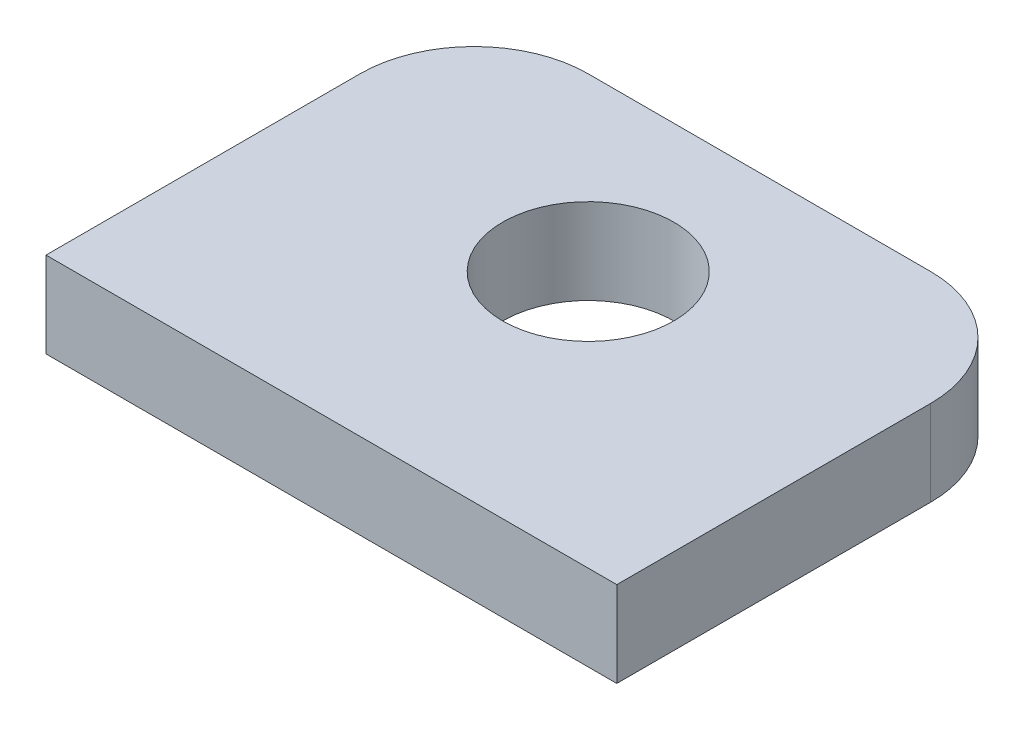
ISO-10303-21;
HEADER;
FILE_DESCRIPTION(('STEP AP214'),'2;1');
FILE_NAME('part.step','',(''),(''),'','','');
FILE_SCHEMA(('AUTOMOTIVE_DESIGN { 1 0 10303 214 1 1 1 1 }'));
ENDSEC;
DATA;
#1=APPLICATION_CONTEXT('core data for automotive mechanical design processes');
#2=APPLICATION_PROTOCOL_DEFINITION('international standard','automotive_design',2000,#1);
#3=PRODUCT_CONTEXT('',#1,'mechanical');
#4=PRODUCT('Part','Part','',(#3));
#5=PRODUCT_RELATED_PRODUCT_CATEGORY('part','',(#4));
#6=PRODUCT_DEFINITION_FORMATION('','',#4);
#7=PRODUCT_DEFINITION_CONTEXT('part definition',#1,'design');
#8=PRODUCT_DEFINITION('design','',#6,#7);
#9=PRODUCT_DEFINITION_SHAPE('','',#8);
#10=(LENGTH_UNIT() NAMED_UNIT(*) SI_UNIT(.MILLI.,.METRE.));
#11=(NAMED_UNIT(*) PLANE_ANGLE_UNIT() SI_UNIT($,.RADIAN.));
#12=(NAMED_UNIT(*) SI_UNIT($,.STERADIAN.) SOLID_ANGLE_UNIT());
#13=UNCERTAINTY_MEASURE_WITH_UNIT(LENGTH_MEASURE(1.E-05),#10,'distance_accuracy_value','');
#14=(GEOMETRIC_REPRESENTATION_CONTEXT(3) GLOBAL_UNCERTAINTY_ASSIGNED_CONTEXT((#13)) GLOBAL_UNIT_ASSIGNED_CONTEXT((#10,
#11,#12)) REPRESENTATION_CONTEXT('',''));
#15=CARTESIAN_POINT('',(0.,0.,0.));
#16=DIRECTION('',(0.,0.,1.));
#17=DIRECTION('',(1.,0.,0.));
#18=AXIS2_PLACEMENT_3D('',#15,#16,#17);
#19=CARTESIAN_POINT('',(3.,1.5,-1.75));
#20=DIRECTION('',(0.,-1.,0.));
#21=DIRECTION('',(0.,0.,-1.));
#22=AXIS2_PLACEMENT_3D('',#19,#20,#21);
#23=PLANE('',#22);
#24=CARTESIAN_POINT('',(3.,1.5,-1.75));
#25=DIRECTION('',(0.,1.,0.));
#26=DIRECTION('',(0.,0.,-1.));
#27=AXIS2_PLACEMENT_3D('',#24,#25,#26);
#28=CIRCLE('',#27,2.);
#29=CARTESIAN_POINT('',(5.,1.5,-1.74999999999999));
#30=VERTEX_POINT('',#29);
#31=CARTESIAN_POINT('',(2.99999999999999,1.5,-3.75));
#32=VERTEX_POINT('',#31);
#33=EDGE_CURVE('E131',#30,#32,#28,.T.);
#34=ORIENTED_EDGE('',*,*,#33,.T.);
#35=DIRECTION('',(-1.,0.,0.));
#36=VECTOR('',#35,1.);
#37=CARTESIAN_POINT('',(-2.99999999999999,1.5,-3.75));
#38=LINE('',#37,#36);
#39=CARTESIAN_POINT('',(-2.99999999999999,1.5,-3.75));
#40=VERTEX_POINT('',#39);
#41=EDGE_CURVE('E89',#32,#40,#38,.T.);
#42=ORIENTED_EDGE('',*,*,#41,.T.);
#43=CARTESIAN_POINT('',(-3.,1.5,-1.75));
#44=DIRECTION('',(0.,1.,0.));
#45=DIRECTION('',(0.,0.,-1.));
#46=AXIS2_PLACEMENT_3D('',#43,#44,#45);
#47=CIRCLE('',#46,2.);
#48=CARTESIAN_POINT('',(-5.,1.5,-1.74999999999999));
#49=VERTEX_POINT('',#48);
#50=EDGE_CURVE('E102',#40,#49,#47,.T.);
#51=ORIENTED_EDGE('',*,*,#50,.T.);
#52=DIRECTION('',(0.,0.,1.));
#53=VECTOR('',#52,1.);
#54=CARTESIAN_POINT('',(-5.,1.5,3.75));
#55=LINE('',#54,#53);
#56=CARTESIAN_POINT('',(-5.,1.5,3.75));
#57=VERTEX_POINT('',#56);
#58=EDGE_CURVE('E96',#49,#57,#55,.T.);
#59=ORIENTED_EDGE('',*,*,#58,.T.);
#60=DIRECTION('',(1.,0.,0.));
#61=VECTOR('',#60,1.);
#62=CARTESIAN_POINT('',(-5.,1.5,3.75));
#63=LINE('',#62,#61);
#64=CARTESIAN_POINT('',(5.,1.5,3.75));
#65=VERTEX_POINT('',#64);
#66=EDGE_CURVE('E100',#57,#65,#63,.T.);
#67=ORIENTED_EDGE('',*,*,#66,.T.);
#68=DIRECTION('',(0.,0.,-1.));
#69=VECTOR('',#68,1.);
#70=CARTESIAN_POINT('',(5.,1.5,3.75));
#71=LINE('',#70,#69);
#72=EDGE_CURVE('E52',#65,#30,#71,.T.);
#73=ORIENTED_EDGE('',*,*,#72,.T.);
#74=EDGE_LOOP('',(#34,#42,#51,#59,#67,#73));
#75=FACE_BOUND('',#74,.T.);
#76=CARTESIAN_POINT('',(0.,1.5,-0.75));
#77=DIRECTION('',(0.,1.,0.));
#78=DIRECTION('',(0.,0.,1.));
#79=AXIS2_PLACEMENT_3D('',#76,#77,#78);
#80=CIRCLE('',#79,1.5);
#81=CARTESIAN_POINT('',(0.,1.5,0.750000000000001));
#82=VERTEX_POINT('',#81);
#83=EDGE_CURVE('E124',#82,#82,#80,.T.);
#84=ORIENTED_EDGE('',*,*,#83,.F.);
#85=EDGE_LOOP('',(#84));
#86=FACE_BOUND('',#85,.T.);
#87=ADVANCED_FACE('F35',(#75,#86),#23,.F.);
#88=CARTESIAN_POINT('',(3.,0.,-1.75));
#89=DIRECTION('',(0.,-1.,0.));
#90=DIRECTION('',(0.,0.,-1.));
#91=AXIS2_PLACEMENT_3D('',#88,#89,#90);
#92=PLANE('',#91);
#93=CARTESIAN_POINT('',(3.,0.,-1.75));
#94=DIRECTION('',(0.,1.,0.));
#95=DIRECTION('',(0.,0.,-1.));
#96=AXIS2_PLACEMENT_3D('',#93,#94,#95);
#97=CIRCLE('',#96,2.);
#98=CARTESIAN_POINT('',(5.,0.,-1.74999999999999));
#99=VERTEX_POINT('',#98);
#100=CARTESIAN_POINT('',(2.99999999999999,0.,-3.75));
#101=VERTEX_POINT('',#100);
#102=EDGE_CURVE('E120',#99,#101,#97,.T.);
#103=ORIENTED_EDGE('',*,*,#102,.F.);
#104=DIRECTION('',(0.,0.,-1.));
#105=VECTOR('',#104,1.);
#106=CARTESIAN_POINT('',(5.,0.,3.75));
#107=LINE('',#106,#105);
#108=CARTESIAN_POINT('',(5.,0.,3.75));
#109=VERTEX_POINT('',#108);
#110=EDGE_CURVE('E81',#109,#99,#107,.T.);
#111=ORIENTED_EDGE('',*,*,#110,.F.);
#112=DIRECTION('',(1.,0.,0.));
#113=VECTOR('',#112,1.);
#114=CARTESIAN_POINT('',(-5.,0.,3.75));
#115=LINE('',#114,#113);
#116=CARTESIAN_POINT('',(-5.,0.,3.75));
#117=VERTEX_POINT('',#116);
#118=EDGE_CURVE('E75',#117,#109,#115,.T.);
#119=ORIENTED_EDGE('',*,*,#118,.F.);
#120=DIRECTION('',(0.,0.,1.));
#121=VECTOR('',#120,1.);
#122=CARTESIAN_POINT('',(-5.,0.,3.75));
#123=LINE('',#122,#121);
#124=CARTESIAN_POINT('',(-5.,0.,-1.74999999999999));
#125=VERTEX_POINT('',#124);
#126=EDGE_CURVE('E110',#125,#117,#123,.T.);
#127=ORIENTED_EDGE('',*,*,#126,.F.);
#128=CARTESIAN_POINT('',(-3.,0.,-1.75));
#129=DIRECTION('',(0.,1.,0.));
#130=DIRECTION('',(0.,0.,-1.));
#131=AXIS2_PLACEMENT_3D('',#128,#129,#130);
#132=CIRCLE('',#131,2.);
#133=CARTESIAN_POINT('',(-2.99999999999999,0.,-3.75));
#134=VERTEX_POINT('',#133);
#135=EDGE_CURVE('E126',#134,#125,#132,.T.);
#136=ORIENTED_EDGE('',*,*,#135,.F.);
#137=DIRECTION('',(-1.,0.,0.));
#138=VECTOR('',#137,1.);
#139=CARTESIAN_POINT('',(-2.99999999999999,0.,-3.75));
#140=LINE('',#139,#138);
#141=EDGE_CURVE('E123',#101,#134,#140,.T.);
#142=ORIENTED_EDGE('',*,*,#141,.F.);
#143=EDGE_LOOP('',(#103,#111,#119,#127,#136,#142));
#144=FACE_BOUND('',#143,.T.);
#145=CARTESIAN_POINT('',(0.,0.,-0.75));
#146=DIRECTION('',(0.,1.,0.));
#147=DIRECTION('',(0.,0.,1.));
#148=AXIS2_PLACEMENT_3D('',#145,#146,#147);
#149=CIRCLE('',#148,1.5);
#150=CARTESIAN_POINT('',(0.,0.,0.750000000000001));
#151=VERTEX_POINT('',#150);
#152=EDGE_CURVE('E224',#151,#151,#149,.T.);
#153=ORIENTED_EDGE('',*,*,#152,.T.);
#154=EDGE_LOOP('',(#153));
#155=FACE_BOUND('',#154,.T.);
#156=ADVANCED_FACE('F140',(#144,#155),#92,.T.);
#157=CARTESIAN_POINT('',(3.,1.5,-1.75));
#158=DIRECTION('',(0.,-1.,0.));
#159=DIRECTION('',(0.,0.,-1.));
#160=AXIS2_PLACEMENT_3D('',#157,#158,#159);
#161=CYLINDRICAL_SURFACE('',#160,2.);
#162=ORIENTED_EDGE('',*,*,#102,.T.);
#163=DIRECTION('',(0.,-1.,0.));
#164=VECTOR('',#163,1.);
#165=CARTESIAN_POINT('',(2.99999999999999,1.5,-3.75));
#166=LINE('',#165,#164);
#167=EDGE_CURVE('E11',#32,#101,#166,.T.);
#168=ORIENTED_EDGE('',*,*,#167,.F.);
#169=ORIENTED_EDGE('',*,*,#33,.F.);
#170=DIRECTION('',(0.,-1.,0.));
#171=VECTOR('',#170,1.);
#172=CARTESIAN_POINT('',(5.,1.5,-1.74999999999999));
#173=LINE('',#172,#171);
#174=EDGE_CURVE('E116',#30,#99,#173,.T.);
#175=ORIENTED_EDGE('',*,*,#174,.T.);
#176=EDGE_LOOP('',(#162,#168,#169,#175));
#177=FACE_BOUND('',#176,.T.);
#178=ADVANCED_FACE('F37',(#177),#161,.T.);
#179=CARTESIAN_POINT('',(-2.99999999999999,1.5,-3.75));
#180=DIRECTION('',(0.,0.,1.));
#181=DIRECTION('',(1.,0.,0.));
#182=AXIS2_PLACEMENT_3D('',#179,#180,#181);
#183=PLANE('',#182);
#184=ORIENTED_EDGE('',*,*,#141,.T.);
#185=DIRECTION('',(0.,-1.,0.));
#186=VECTOR('',#185,1.);
#187=CARTESIAN_POINT('',(-2.99999999999999,1.5,-3.75));
#188=LINE('',#187,#186);
#189=EDGE_CURVE('E44',#40,#134,#188,.T.);
#190=ORIENTED_EDGE('',*,*,#189,.F.);
#191=ORIENTED_EDGE('',*,*,#41,.F.);
#192=ORIENTED_EDGE('',*,*,#167,.T.);
#193=EDGE_LOOP('',(#184,#190,#191,#192));
#194=FACE_BOUND('',#193,.T.);
#195=ADVANCED_FACE('F165',(#194),#183,.F.);
#196=CARTESIAN_POINT('',(-3.,1.5,-1.75));
#197=DIRECTION('',(0.,-1.,0.));
#198=DIRECTION('',(0.,0.,-1.));
#199=AXIS2_PLACEMENT_3D('',#196,#197,#198);
#200=CYLINDRICAL_SURFACE('',#199,2.);
#201=ORIENTED_EDGE('',*,*,#135,.T.);
#202=DIRECTION('',(0.,-1.,0.));
#203=VECTOR('',#202,1.);
#204=CARTESIAN_POINT('',(-5.,1.5,-1.74999999999999));
#205=LINE('',#204,#203);
#206=EDGE_CURVE('E111',#49,#125,#205,.T.);
#207=ORIENTED_EDGE('',*,*,#206,.F.);
#208=ORIENTED_EDGE('',*,*,#50,.F.);
#209=ORIENTED_EDGE('',*,*,#189,.T.);
#210=EDGE_LOOP('',(#201,#207,#208,#209));
#211=FACE_BOUND('',#210,.T.);
#212=ADVANCED_FACE('F137',(#211),#200,.T.);
#213=CARTESIAN_POINT('',(-5.,1.5,3.75));
#214=DIRECTION('',(1.,0.,0.));
#215=DIRECTION('',(0.,0.,-1.));
#216=AXIS2_PLACEMENT_3D('',#213,#214,#215);
#217=PLANE('',#216);
#218=ORIENTED_EDGE('',*,*,#126,.T.);
#219=DIRECTION('',(0.,-1.,0.));
#220=VECTOR('',#219,1.);
#221=CARTESIAN_POINT('',(-5.,1.5,3.75));
#222=LINE('',#221,#220);
#223=EDGE_CURVE('E107',#57,#117,#222,.T.);
#224=ORIENTED_EDGE('',*,*,#223,.F.);
#225=ORIENTED_EDGE('',*,*,#58,.F.);
#226=ORIENTED_EDGE('',*,*,#206,.T.);
#227=EDGE_LOOP('',(#218,#224,#225,#226));
#228=FACE_BOUND('',#227,.T.);
#229=ADVANCED_FACE('F108',(#228),#217,.F.);
#230=CARTESIAN_POINT('',(-5.,1.5,3.75));
#231=DIRECTION('',(0.,0.,-1.));
#232=DIRECTION('',(-1.,0.,0.));
#233=AXIS2_PLACEMENT_3D('',#230,#231,#232);
#234=PLANE('',#233);
#235=ORIENTED_EDGE('',*,*,#118,.T.);
#236=DIRECTION('',(0.,-1.,0.));
#237=VECTOR('',#236,1.);
#238=CARTESIAN_POINT('',(5.,1.5,3.75));
#239=LINE('',#238,#237);
#240=EDGE_CURVE('E112',#65,#109,#239,.T.);
#241=ORIENTED_EDGE('',*,*,#240,.F.);
#242=ORIENTED_EDGE('',*,*,#66,.F.);
#243=ORIENTED_EDGE('',*,*,#223,.T.);
#244=EDGE_LOOP('',(#235,#241,#242,#243));
#245=FACE_BOUND('',#244,.T.);
#246=ADVANCED_FACE('F114',(#245),#234,.F.);
#247=CARTESIAN_POINT('',(5.,1.5,3.75));
#248=DIRECTION('',(-1.,0.,0.));
#249=DIRECTION('',(0.,0.,1.));
#250=AXIS2_PLACEMENT_3D('',#247,#248,#249);
#251=PLANE('',#250);
#252=ORIENTED_EDGE('',*,*,#110,.T.);
#253=ORIENTED_EDGE('',*,*,#174,.F.);
#254=ORIENTED_EDGE('',*,*,#72,.F.);
#255=ORIENTED_EDGE('',*,*,#240,.T.);
#256=EDGE_LOOP('',(#252,#253,#254,#255));
#257=FACE_BOUND('',#256,.T.);
#258=ADVANCED_FACE('F145',(#257),#251,.F.);
#259=CARTESIAN_POINT('',(0.,1.5,-0.75));
#260=DIRECTION('',(0.,-1.,0.));
#261=DIRECTION('',(0.,0.,-1.));
#262=AXIS2_PLACEMENT_3D('',#259,#260,#261);
#263=CYLINDRICAL_SURFACE('',#262,1.5);
#264=ORIENTED_EDGE('',*,*,#83,.T.);
#265=EDGE_LOOP('',(#264));
#266=FACE_BOUND('',#265,.T.);
#267=ORIENTED_EDGE('',*,*,#152,.F.);
#268=EDGE_LOOP('',(#267));
#269=FACE_BOUND('',#268,.T.);
#270=ADVANCED_FACE('F147',(#266,#269),#263,.F.);
#271=CLOSED_SHELL('',(#87,#156,#178,#195,#212,#229,#246,#258,#270));
#272=MANIFOLD_SOLID_BREP('B2',#271);
#273=ADVANCED_BREP_SHAPE_REPRESENTATION('',(#18,#272),#14);
#274=SHAPE_DEFINITION_REPRESENTATION(#9,#273);
ENDSEC;
END-ISO-10303-21;
